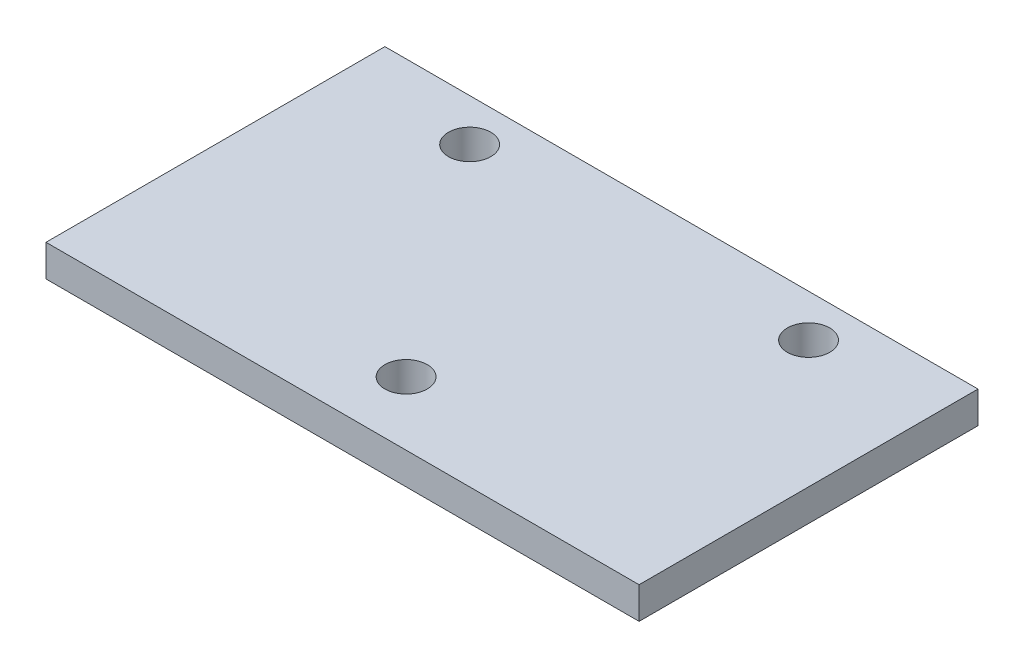
ISO-10303-21;
HEADER;
FILE_DESCRIPTION(('STEP AP214'),'2;1');
FILE_NAME('part.step','',(''),(''),'','','');
FILE_SCHEMA(('AUTOMOTIVE_DESIGN { 1 0 10303 214 1 1 1 1 }'));
ENDSEC;
DATA;
#1=APPLICATION_CONTEXT('core data for automotive mechanical design processes');
#2=APPLICATION_PROTOCOL_DEFINITION('international standard','automotive_design',2000,#1);
#3=PRODUCT_CONTEXT('',#1,'mechanical');
#4=PRODUCT('Part','Part','',(#3));
#5=PRODUCT_RELATED_PRODUCT_CATEGORY('part','',(#4));
#6=PRODUCT_DEFINITION_FORMATION('','',#4);
#7=PRODUCT_DEFINITION_CONTEXT('part definition',#1,'design');
#8=PRODUCT_DEFINITION('design','',#6,#7);
#9=PRODUCT_DEFINITION_SHAPE('','',#8);
#10=(LENGTH_UNIT() NAMED_UNIT(*) SI_UNIT(.MILLI.,.METRE.));
#11=(NAMED_UNIT(*) PLANE_ANGLE_UNIT() SI_UNIT($,.RADIAN.));
#12=(NAMED_UNIT(*) SI_UNIT($,.STERADIAN.) SOLID_ANGLE_UNIT());
#13=UNCERTAINTY_MEASURE_WITH_UNIT(LENGTH_MEASURE(1.E-05),#10,'distance_accuracy_value','');
#14=(GEOMETRIC_REPRESENTATION_CONTEXT(3) GLOBAL_UNCERTAINTY_ASSIGNED_CONTEXT((#13)) GLOBAL_UNIT_ASSIGNED_CONTEXT((#10,
#11,#12)) REPRESENTATION_CONTEXT('',''));
#15=CARTESIAN_POINT('',(0.,0.,0.));
#16=DIRECTION('',(0.,0.,1.));
#17=DIRECTION('',(1.,0.,0.));
#18=AXIS2_PLACEMENT_3D('',#15,#16,#17);
#19=CARTESIAN_POINT('',(-88.9,9.525,50.8));
#20=DIRECTION('',(-1.,0.,0.));
#21=DIRECTION('',(0.,0.,1.));
#22=AXIS2_PLACEMENT_3D('',#19,#20,#21);
#23=PLANE('',#22);
#24=DIRECTION('',(0.,0.,-1.));
#25=VECTOR('',#24,1.);
#26=CARTESIAN_POINT('',(-88.9,0.,50.8));
#27=LINE('',#26,#25);
#28=CARTESIAN_POINT('',(-88.9,0.,50.8));
#29=VERTEX_POINT('',#28);
#30=CARTESIAN_POINT('',(-88.9,0.,-50.8));
#31=VERTEX_POINT('',#30);
#32=EDGE_CURVE('E98',#29,#31,#27,.T.);
#33=ORIENTED_EDGE('',*,*,#32,.F.);
#34=DIRECTION('',(0.,-1.,0.));
#35=VECTOR('',#34,1.);
#36=CARTESIAN_POINT('',(-88.9,9.525,50.8));
#37=LINE('',#36,#35);
#38=CARTESIAN_POINT('',(-88.9,9.525,50.8));
#39=VERTEX_POINT('',#38);
#40=EDGE_CURVE('E11',#39,#29,#37,.T.);
#41=ORIENTED_EDGE('',*,*,#40,.F.);
#42=DIRECTION('',(0.,0.,-1.));
#43=VECTOR('',#42,1.);
#44=CARTESIAN_POINT('',(-88.9,9.525,50.8));
#45=LINE('',#44,#43);
#46=CARTESIAN_POINT('',(-88.9,9.525,-50.8));
#47=VERTEX_POINT('',#46);
#48=EDGE_CURVE('E90',#39,#47,#45,.T.);
#49=ORIENTED_EDGE('',*,*,#48,.T.);
#50=DIRECTION('',(0.,-1.,0.));
#51=VECTOR('',#50,1.);
#52=CARTESIAN_POINT('',(-88.9,9.525,-50.8));
#53=LINE('',#52,#51);
#54=EDGE_CURVE('E37',#47,#31,#53,.T.);
#55=ORIENTED_EDGE('',*,*,#54,.T.);
#56=EDGE_LOOP('',(#33,#41,#49,#55));
#57=FACE_BOUND('',#56,.T.);
#58=ADVANCED_FACE('F34',(#57),#23,.T.);
#59=CARTESIAN_POINT('',(-88.9,9.525,50.8));
#60=DIRECTION('',(0.,0.,-1.));
#61=DIRECTION('',(-1.,0.,0.));
#62=AXIS2_PLACEMENT_3D('',#59,#60,#61);
#63=PLANE('',#62);
#64=DIRECTION('',(1.,0.,0.));
#65=VECTOR('',#64,1.);
#66=CARTESIAN_POINT('',(-88.9,0.,50.8));
#67=LINE('',#66,#65);
#68=CARTESIAN_POINT('',(88.9,0.,50.8));
#69=VERTEX_POINT('',#68);
#70=EDGE_CURVE('E105',#29,#69,#67,.T.);
#71=ORIENTED_EDGE('',*,*,#70,.T.);
#72=DIRECTION('',(0.,-1.,0.));
#73=VECTOR('',#72,1.);
#74=CARTESIAN_POINT('',(88.9,9.525,50.8));
#75=LINE('',#74,#73);
#76=CARTESIAN_POINT('',(88.9,9.525,50.8));
#77=VERTEX_POINT('',#76);
#78=EDGE_CURVE('E43',#77,#69,#75,.T.);
#79=ORIENTED_EDGE('',*,*,#78,.F.);
#80=DIRECTION('',(1.,0.,0.));
#81=VECTOR('',#80,1.);
#82=CARTESIAN_POINT('',(-88.9,9.525,50.8));
#83=LINE('',#82,#81);
#84=EDGE_CURVE('E93',#39,#77,#83,.T.);
#85=ORIENTED_EDGE('',*,*,#84,.F.);
#86=ORIENTED_EDGE('',*,*,#40,.T.);
#87=EDGE_LOOP('',(#71,#79,#85,#86));
#88=FACE_BOUND('',#87,.T.);
#89=ADVANCED_FACE('F156',(#88),#63,.F.);
#90=CARTESIAN_POINT('',(88.9,9.525,-50.8));
#91=DIRECTION('',(1.,0.,0.));
#92=DIRECTION('',(0.,0.,-1.));
#93=AXIS2_PLACEMENT_3D('',#90,#91,#92);
#94=PLANE('',#93);
#95=DIRECTION('',(0.,0.,1.));
#96=VECTOR('',#95,1.);
#97=CARTESIAN_POINT('',(88.9,0.,-50.8));
#98=LINE('',#97,#96);
#99=CARTESIAN_POINT('',(88.9,0.,-50.8));
#100=VERTEX_POINT('',#99);
#101=EDGE_CURVE('E85',#100,#69,#98,.T.);
#102=ORIENTED_EDGE('',*,*,#101,.F.);
#103=DIRECTION('',(0.,-1.,0.));
#104=VECTOR('',#103,1.);
#105=CARTESIAN_POINT('',(88.9,9.525,-50.8));
#106=LINE('',#105,#104);
#107=CARTESIAN_POINT('',(88.9,9.525,-50.8));
#108=VERTEX_POINT('',#107);
#109=EDGE_CURVE('E81',#108,#100,#106,.T.);
#110=ORIENTED_EDGE('',*,*,#109,.F.);
#111=DIRECTION('',(0.,0.,1.));
#112=VECTOR('',#111,1.);
#113=CARTESIAN_POINT('',(88.9,9.525,-50.8));
#114=LINE('',#113,#112);
#115=EDGE_CURVE('E83',#108,#77,#114,.T.);
#116=ORIENTED_EDGE('',*,*,#115,.T.);
#117=ORIENTED_EDGE('',*,*,#78,.T.);
#118=EDGE_LOOP('',(#102,#110,#116,#117));
#119=FACE_BOUND('',#118,.T.);
#120=ADVANCED_FACE('F82',(#119),#94,.T.);
#121=CARTESIAN_POINT('',(88.9,9.525,-50.8));
#122=DIRECTION('',(0.,0.,1.));
#123=DIRECTION('',(1.,0.,0.));
#124=AXIS2_PLACEMENT_3D('',#121,#122,#123);
#125=PLANE('',#124);
#126=DIRECTION('',(-1.,0.,0.));
#127=VECTOR('',#126,1.);
#128=CARTESIAN_POINT('',(88.9,0.,-50.8));
#129=LINE('',#128,#127);
#130=EDGE_CURVE('E101',#100,#31,#129,.T.);
#131=ORIENTED_EDGE('',*,*,#130,.T.);
#132=ORIENTED_EDGE('',*,*,#54,.F.);
#133=DIRECTION('',(-1.,0.,0.));
#134=VECTOR('',#133,1.);
#135=CARTESIAN_POINT('',(88.9,9.525,-50.8));
#136=LINE('',#135,#134);
#137=EDGE_CURVE('E78',#108,#47,#136,.T.);
#138=ORIENTED_EDGE('',*,*,#137,.F.);
#139=ORIENTED_EDGE('',*,*,#109,.T.);
#140=EDGE_LOOP('',(#131,#132,#138,#139));
#141=FACE_BOUND('',#140,.T.);
#142=ADVANCED_FACE('F89',(#141),#125,.F.);
#143=CARTESIAN_POINT('',(-88.9,9.525,50.8));
#144=DIRECTION('',(0.,-1.,0.));
#145=DIRECTION('',(0.,0.,-1.));
#146=AXIS2_PLACEMENT_3D('',#143,#144,#145);
#147=PLANE('',#146);
#148=CARTESIAN_POINT('',(0.,9.525,31.75));
#149=DIRECTION('',(0.,1.,0.));
#150=DIRECTION('',(0.,0.,1.));
#151=AXIS2_PLACEMENT_3D('',#148,#149,#150);
#152=CIRCLE('',#151,6.35);
#153=CARTESIAN_POINT('',(0.,9.525,38.1));
#154=VERTEX_POINT('',#153);
#155=EDGE_CURVE('E120',#154,#154,#152,.T.);
#156=ORIENTED_EDGE('',*,*,#155,.F.);
#157=EDGE_LOOP('',(#156));
#158=FACE_BOUND('',#157,.T.);
#159=CARTESIAN_POINT('',(50.8,9.525,-38.1));
#160=DIRECTION('',(0.,1.,0.));
#161=DIRECTION('',(0.,0.,1.));
#162=AXIS2_PLACEMENT_3D('',#159,#160,#161);
#163=CIRCLE('',#162,6.35);
#164=CARTESIAN_POINT('',(50.8,9.525,-31.75));
#165=VERTEX_POINT('',#164);
#166=EDGE_CURVE('E114',#165,#165,#163,.T.);
#167=ORIENTED_EDGE('',*,*,#166,.F.);
#168=EDGE_LOOP('',(#167));
#169=FACE_BOUND('',#168,.T.);
#170=CARTESIAN_POINT('',(-50.8,9.525,-38.1));
#171=DIRECTION('',(0.,1.,0.));
#172=DIRECTION('',(0.,0.,1.));
#173=AXIS2_PLACEMENT_3D('',#170,#171,#172);
#174=CIRCLE('',#173,6.35);
#175=CARTESIAN_POINT('',(-50.8,9.525,-31.75));
#176=VERTEX_POINT('',#175);
#177=EDGE_CURVE('E108',#176,#176,#174,.T.);
#178=ORIENTED_EDGE('',*,*,#177,.F.);
#179=EDGE_LOOP('',(#178));
#180=FACE_BOUND('',#179,.T.);
#181=ORIENTED_EDGE('',*,*,#48,.F.);
#182=ORIENTED_EDGE('',*,*,#84,.T.);
#183=ORIENTED_EDGE('',*,*,#115,.F.);
#184=ORIENTED_EDGE('',*,*,#137,.T.);
#185=EDGE_LOOP('',(#181,#182,#183,#184));
#186=FACE_BOUND('',#185,.T.);
#187=ADVANCED_FACE('F92',(#158,#169,#180,#186),#147,.F.);
#188=CARTESIAN_POINT('',(-88.9,0.,50.8));
#189=DIRECTION('',(0.,-1.,0.));
#190=DIRECTION('',(0.,0.,-1.));
#191=AXIS2_PLACEMENT_3D('',#188,#189,#190);
#192=PLANE('',#191);
#193=CARTESIAN_POINT('',(0.,0.,31.75));
#194=DIRECTION('',(0.,1.,0.));
#195=DIRECTION('',(0.,0.,1.));
#196=AXIS2_PLACEMENT_3D('',#193,#194,#195);
#197=CIRCLE('',#196,6.35);
#198=CARTESIAN_POINT('',(0.,0.,38.1));
#199=VERTEX_POINT('',#198);
#200=EDGE_CURVE('E117',#199,#199,#197,.T.);
#201=ORIENTED_EDGE('',*,*,#200,.T.);
#202=EDGE_LOOP('',(#201));
#203=FACE_BOUND('',#202,.T.);
#204=CARTESIAN_POINT('',(50.8,0.,-38.1));
#205=DIRECTION('',(0.,1.,0.));
#206=DIRECTION('',(0.,0.,1.));
#207=AXIS2_PLACEMENT_3D('',#204,#205,#206);
#208=CIRCLE('',#207,6.35);
#209=CARTESIAN_POINT('',(50.8,0.,-31.75));
#210=VERTEX_POINT('',#209);
#211=EDGE_CURVE('E111',#210,#210,#208,.T.);
#212=ORIENTED_EDGE('',*,*,#211,.T.);
#213=EDGE_LOOP('',(#212));
#214=FACE_BOUND('',#213,.T.);
#215=CARTESIAN_POINT('',(-50.8,0.,-38.1));
#216=DIRECTION('',(0.,1.,0.));
#217=DIRECTION('',(0.,0.,1.));
#218=AXIS2_PLACEMENT_3D('',#215,#216,#217);
#219=CIRCLE('',#218,6.35);
#220=CARTESIAN_POINT('',(-50.8,0.,-31.75));
#221=VERTEX_POINT('',#220);
#222=EDGE_CURVE('E102',#221,#221,#219,.T.);
#223=ORIENTED_EDGE('',*,*,#222,.T.);
#224=EDGE_LOOP('',(#223));
#225=FACE_BOUND('',#224,.T.);
#226=ORIENTED_EDGE('',*,*,#32,.T.);
#227=ORIENTED_EDGE('',*,*,#130,.F.);
#228=ORIENTED_EDGE('',*,*,#101,.T.);
#229=ORIENTED_EDGE('',*,*,#70,.F.);
#230=EDGE_LOOP('',(#226,#227,#228,#229));
#231=FACE_BOUND('',#230,.T.);
#232=ADVANCED_FACE('F126',(#203,#214,#225,#231),#192,.T.);
#233=CARTESIAN_POINT('',(-50.8,0.,-38.1));
#234=DIRECTION('',(0.,1.,0.));
#235=DIRECTION('',(0.,0.,1.));
#236=AXIS2_PLACEMENT_3D('',#233,#234,#235);
#237=CYLINDRICAL_SURFACE('',#236,6.35);
#238=CARTESIAN_POINT('',(-50.8,0.,-31.75));
#239=CARTESIAN_POINT('',(-50.8,0.0992187499999999,-31.75));
#240=CARTESIAN_POINT('',(-50.8,0.1984375,-31.75));
#241=CARTESIAN_POINT('',(-50.8,0.396875,-31.75));
#242=CARTESIAN_POINT('',(-50.8,0.49609375,-31.75));
#243=CARTESIAN_POINT('',(-50.8,0.69453125,-31.75));
#244=CARTESIAN_POINT('',(-50.8,0.79375,-31.75));
#245=CARTESIAN_POINT('',(-50.8,0.9921875,-31.75));
#246=CARTESIAN_POINT('',(-50.8,1.09140625,-31.75));
#247=CARTESIAN_POINT('',(-50.8,1.28984375,-31.75));
#248=CARTESIAN_POINT('',(-50.8,1.3890625,-31.75));
#249=CARTESIAN_POINT('',(-50.8,1.5875,-31.75));
#250=CARTESIAN_POINT('',(-50.8,1.68671875,-31.75));
#251=CARTESIAN_POINT('',(-50.8,1.88515625,-31.75));
#252=CARTESIAN_POINT('',(-50.8,1.984375,-31.75));
#253=CARTESIAN_POINT('',(-50.8,2.1828125,-31.75));
#254=CARTESIAN_POINT('',(-50.8,2.28203125,-31.75));
#255=CARTESIAN_POINT('',(-50.8,2.48046875,-31.75));
#256=CARTESIAN_POINT('',(-50.8,2.5796875,-31.75));
#257=CARTESIAN_POINT('',(-50.8,2.778125,-31.75));
#258=CARTESIAN_POINT('',(-50.8,2.87734375,-31.75));
#259=CARTESIAN_POINT('',(-50.8,3.07578125,-31.75));
#260=CARTESIAN_POINT('',(-50.8,3.175,-31.75));
#261=CARTESIAN_POINT('',(-50.8,3.3734375,-31.75));
#262=CARTESIAN_POINT('',(-50.8,3.47265625,-31.75));
#263=CARTESIAN_POINT('',(-50.8,3.67109375,-31.75));
#264=CARTESIAN_POINT('',(-50.8,3.7703125,-31.75));
#265=CARTESIAN_POINT('',(-50.8,3.96875,-31.75));
#266=CARTESIAN_POINT('',(-50.8,4.06796875,-31.75));
#267=CARTESIAN_POINT('',(-50.8,4.26640625,-31.75));
#268=CARTESIAN_POINT('',(-50.8,4.365625,-31.75));
#269=CARTESIAN_POINT('',(-50.8,4.5640625,-31.75));
#270=CARTESIAN_POINT('',(-50.8,4.66328125,-31.75));
#271=CARTESIAN_POINT('',(-50.8,4.86171875,-31.75));
#272=CARTESIAN_POINT('',(-50.8,4.9609375,-31.75));
#273=CARTESIAN_POINT('',(-50.8,5.159375,-31.75));
#274=CARTESIAN_POINT('',(-50.8,5.25859375,-31.75));
#275=CARTESIAN_POINT('',(-50.8,5.45703125,-31.75));
#276=CARTESIAN_POINT('',(-50.8,5.55625,-31.75));
#277=CARTESIAN_POINT('',(-50.8,5.7546875,-31.75));
#278=CARTESIAN_POINT('',(-50.8,5.85390625,-31.75));
#279=CARTESIAN_POINT('',(-50.8,6.05234375,-31.75));
#280=CARTESIAN_POINT('',(-50.8,6.1515625,-31.75));
#281=CARTESIAN_POINT('',(-50.8,6.35,-31.75));
#282=CARTESIAN_POINT('',(-50.8,6.44921875,-31.75));
#283=CARTESIAN_POINT('',(-50.8,6.64765625,-31.75));
#284=CARTESIAN_POINT('',(-50.8,6.746875,-31.75));
#285=CARTESIAN_POINT('',(-50.8,6.9453125,-31.75));
#286=CARTESIAN_POINT('',(-50.8,7.04453125,-31.75));
#287=CARTESIAN_POINT('',(-50.8,7.24296875,-31.75));
#288=CARTESIAN_POINT('',(-50.8,7.3421875,-31.75));
#289=CARTESIAN_POINT('',(-50.8,7.540625,-31.75));
#290=CARTESIAN_POINT('',(-50.8,7.63984375,-31.75));
#291=CARTESIAN_POINT('',(-50.8,7.83828125,-31.75));
#292=CARTESIAN_POINT('',(-50.8,7.9375,-31.75));
#293=CARTESIAN_POINT('',(-50.8,8.1359375,-31.75));
#294=CARTESIAN_POINT('',(-50.8,8.23515625,-31.75));
#295=CARTESIAN_POINT('',(-50.8,8.43359375,-31.75));
#296=CARTESIAN_POINT('',(-50.8,8.5328125,-31.75));
#297=CARTESIAN_POINT('',(-50.8,8.73125,-31.75));
#298=CARTESIAN_POINT('',(-50.8,8.83046875,-31.75));
#299=CARTESIAN_POINT('',(-50.8,9.02890625,-31.75));
#300=CARTESIAN_POINT('',(-50.8,9.128125,-31.75));
#301=CARTESIAN_POINT('',(-50.8,9.3265625,-31.75));
#302=CARTESIAN_POINT('',(-50.8,9.42578125,-31.75));
#303=CARTESIAN_POINT('',(-50.8,9.525,-31.75));
#304=B_SPLINE_CURVE_WITH_KNOTS('',3,(#238,#239,#240,#241,#242,#243,#244,#245,#246,#247,#248,
#249,#250,#251,#252,#253,#254,#255,#256,#257,#258,#259,#260,#261,#262,#263,#264,#265,#266,#267,
#268,#269,#270,#271,#272,#273,#274,#275,#276,#277,#278,#279,#280,#281,#282,#283,#284,#285,#286,
#287,#288,#289,#290,#291,#292,#293,#294,#295,#296,#297,#298,#299,#300,#301,#302,#303),
.UNSPECIFIED.,.F.,.F.,(4,2,2,2,2,2,2,2,2,2,2,2,2,2,2,2,2,2,2,2,2,2,2,2,2,2,2,2,2,2,2,2,4),(0.,
0.29765625,0.5953125,0.89296875,1.190625,1.48828125,1.7859375,2.08359375,2.38125,2.67890625,
2.9765625,3.27421875,3.571875,3.86953125,4.1671875,4.46484375,4.7625,5.06015625,5.3578125,
5.65546875,5.953125,6.25078125,6.5484375,6.84609375,7.14375,7.44140625,7.7390625,8.03671875,
8.334375,8.63203125,8.9296875,9.22734375,9.525),.UNSPECIFIED.);
#305=EDGE_CURVE('BSEAM143',#221,#176,#304,.T.);
#306=ORIENTED_EDGE('',*,*,#222,.F.);
#307=ORIENTED_EDGE('',*,*,#177,.T.);
#308=ORIENTED_EDGE('',*,*,#305,.T.);
#309=ORIENTED_EDGE('',*,*,#305,.F.);
#310=EDGE_LOOP('',(#306,#308,#307,#309));
#311=FACE_BOUND('',#310,.T.);
#312=ADVANCED_FACE('F143',(#311),#237,.F.);
#313=CARTESIAN_POINT('',(50.8,0.,-38.1));
#314=DIRECTION('',(0.,1.,0.));
#315=DIRECTION('',(0.,0.,1.));
#316=AXIS2_PLACEMENT_3D('',#313,#314,#315);
#317=CYLINDRICAL_SURFACE('',#316,6.35);
#318=CARTESIAN_POINT('',(50.8,0.,-31.75));
#319=CARTESIAN_POINT('',(50.8,0.0992187499999999,-31.75));
#320=CARTESIAN_POINT('',(50.8,0.1984375,-31.75));
#321=CARTESIAN_POINT('',(50.8,0.396875,-31.75));
#322=CARTESIAN_POINT('',(50.8,0.49609375,-31.75));
#323=CARTESIAN_POINT('',(50.8,0.69453125,-31.75));
#324=CARTESIAN_POINT('',(50.8,0.79375,-31.75));
#325=CARTESIAN_POINT('',(50.8,0.9921875,-31.75));
#326=CARTESIAN_POINT('',(50.8,1.09140625,-31.75));
#327=CARTESIAN_POINT('',(50.8,1.28984375,-31.75));
#328=CARTESIAN_POINT('',(50.8,1.3890625,-31.75));
#329=CARTESIAN_POINT('',(50.8,1.5875,-31.75));
#330=CARTESIAN_POINT('',(50.8,1.68671875,-31.75));
#331=CARTESIAN_POINT('',(50.8,1.88515625,-31.75));
#332=CARTESIAN_POINT('',(50.8,1.984375,-31.75));
#333=CARTESIAN_POINT('',(50.8,2.1828125,-31.75));
#334=CARTESIAN_POINT('',(50.8,2.28203125,-31.75));
#335=CARTESIAN_POINT('',(50.8,2.48046875,-31.75));
#336=CARTESIAN_POINT('',(50.8,2.5796875,-31.75));
#337=CARTESIAN_POINT('',(50.8,2.778125,-31.75));
#338=CARTESIAN_POINT('',(50.8,2.87734375,-31.75));
#339=CARTESIAN_POINT('',(50.8,3.07578125,-31.75));
#340=CARTESIAN_POINT('',(50.8,3.175,-31.75));
#341=CARTESIAN_POINT('',(50.8,3.3734375,-31.75));
#342=CARTESIAN_POINT('',(50.8,3.47265625,-31.75));
#343=CARTESIAN_POINT('',(50.8,3.67109375,-31.75));
#344=CARTESIAN_POINT('',(50.8,3.7703125,-31.75));
#345=CARTESIAN_POINT('',(50.8,3.96875,-31.75));
#346=CARTESIAN_POINT('',(50.8,4.06796875,-31.75));
#347=CARTESIAN_POINT('',(50.8,4.26640625,-31.75));
#348=CARTESIAN_POINT('',(50.8,4.365625,-31.75));
#349=CARTESIAN_POINT('',(50.8,4.5640625,-31.75));
#350=CARTESIAN_POINT('',(50.8,4.66328125,-31.75));
#351=CARTESIAN_POINT('',(50.8,4.86171875,-31.75));
#352=CARTESIAN_POINT('',(50.8,4.9609375,-31.75));
#353=CARTESIAN_POINT('',(50.8,5.159375,-31.75));
#354=CARTESIAN_POINT('',(50.8,5.25859375,-31.75));
#355=CARTESIAN_POINT('',(50.8,5.45703125,-31.75));
#356=CARTESIAN_POINT('',(50.8,5.55625,-31.75));
#357=CARTESIAN_POINT('',(50.8,5.7546875,-31.75));
#358=CARTESIAN_POINT('',(50.8,5.85390625,-31.75));
#359=CARTESIAN_POINT('',(50.8,6.05234375,-31.75));
#360=CARTESIAN_POINT('',(50.8,6.1515625,-31.75));
#361=CARTESIAN_POINT('',(50.8,6.35,-31.75));
#362=CARTESIAN_POINT('',(50.8,6.44921875,-31.75));
#363=CARTESIAN_POINT('',(50.8,6.64765625,-31.75));
#364=CARTESIAN_POINT('',(50.8,6.746875,-31.75));
#365=CARTESIAN_POINT('',(50.8,6.9453125,-31.75));
#366=CARTESIAN_POINT('',(50.8,7.04453125,-31.75));
#367=CARTESIAN_POINT('',(50.8,7.24296875,-31.75));
#368=CARTESIAN_POINT('',(50.8,7.3421875,-31.75));
#369=CARTESIAN_POINT('',(50.8,7.540625,-31.75));
#370=CARTESIAN_POINT('',(50.8,7.63984375,-31.75));
#371=CARTESIAN_POINT('',(50.8,7.83828125,-31.75));
#372=CARTESIAN_POINT('',(50.8,7.9375,-31.75));
#373=CARTESIAN_POINT('',(50.8,8.1359375,-31.75));
#374=CARTESIAN_POINT('',(50.8,8.23515625,-31.75));
#375=CARTESIAN_POINT('',(50.8,8.43359375,-31.75));
#376=CARTESIAN_POINT('',(50.8,8.5328125,-31.75));
#377=CARTESIAN_POINT('',(50.8,8.73125,-31.75));
#378=CARTESIAN_POINT('',(50.8,8.83046875,-31.75));
#379=CARTESIAN_POINT('',(50.8,9.02890625,-31.75));
#380=CARTESIAN_POINT('',(50.8,9.128125,-31.75));
#381=CARTESIAN_POINT('',(50.8,9.3265625,-31.75));
#382=CARTESIAN_POINT('',(50.8,9.42578125,-31.75));
#383=CARTESIAN_POINT('',(50.8,9.525,-31.75));
#384=B_SPLINE_CURVE_WITH_KNOTS('',3,(#318,#319,#320,#321,#322,#323,#324,#325,#326,#327,#328,
#329,#330,#331,#332,#333,#334,#335,#336,#337,#338,#339,#340,#341,#342,#343,#344,#345,#346,#347,
#348,#349,#350,#351,#352,#353,#354,#355,#356,#357,#358,#359,#360,#361,#362,#363,#364,#365,#366,
#367,#368,#369,#370,#371,#372,#373,#374,#375,#376,#377,#378,#379,#380,#381,#382,#383),
.UNSPECIFIED.,.F.,.F.,(4,2,2,2,2,2,2,2,2,2,2,2,2,2,2,2,2,2,2,2,2,2,2,2,2,2,2,2,2,2,2,2,4),(0.,
0.29765625,0.5953125,0.89296875,1.190625,1.48828125,1.7859375,2.08359375,2.38125,2.67890625,
2.9765625,3.27421875,3.571875,3.86953125,4.1671875,4.46484375,4.7625,5.06015625,5.3578125,
5.65546875,5.953125,6.25078125,6.5484375,6.84609375,7.14375,7.44140625,7.7390625,8.03671875,
8.334375,8.63203125,8.9296875,9.22734375,9.525),.UNSPECIFIED.);
#385=EDGE_CURVE('BSEAM132',#210,#165,#384,.T.);
#386=ORIENTED_EDGE('',*,*,#211,.F.);
#387=ORIENTED_EDGE('',*,*,#166,.T.);
#388=ORIENTED_EDGE('',*,*,#385,.T.);
#389=ORIENTED_EDGE('',*,*,#385,.F.);
#390=EDGE_LOOP('',(#386,#388,#387,#389));
#391=FACE_BOUND('',#390,.T.);
#392=ADVANCED_FACE('F132',(#391),#317,.F.);
#393=CARTESIAN_POINT('',(0.,0.,31.75));
#394=DIRECTION('',(0.,1.,0.));
#395=DIRECTION('',(0.,0.,1.));
#396=AXIS2_PLACEMENT_3D('',#393,#394,#395);
#397=CYLINDRICAL_SURFACE('',#396,6.35);
#398=CARTESIAN_POINT('',(0.,0.,38.1));
#399=CARTESIAN_POINT('',(0.,0.0992187499999999,38.1));
#400=CARTESIAN_POINT('',(0.,0.1984375,38.1));
#401=CARTESIAN_POINT('',(0.,0.396875,38.1));
#402=CARTESIAN_POINT('',(0.,0.49609375,38.1));
#403=CARTESIAN_POINT('',(0.,0.69453125,38.1));
#404=CARTESIAN_POINT('',(0.,0.79375,38.1));
#405=CARTESIAN_POINT('',(0.,0.9921875,38.1));
#406=CARTESIAN_POINT('',(0.,1.09140625,38.1));
#407=CARTESIAN_POINT('',(0.,1.28984375,38.1));
#408=CARTESIAN_POINT('',(0.,1.3890625,38.1));
#409=CARTESIAN_POINT('',(0.,1.5875,38.1));
#410=CARTESIAN_POINT('',(0.,1.68671875,38.1));
#411=CARTESIAN_POINT('',(0.,1.88515625,38.1));
#412=CARTESIAN_POINT('',(0.,1.984375,38.1));
#413=CARTESIAN_POINT('',(0.,2.1828125,38.1));
#414=CARTESIAN_POINT('',(0.,2.28203125,38.1));
#415=CARTESIAN_POINT('',(0.,2.48046875,38.1));
#416=CARTESIAN_POINT('',(0.,2.5796875,38.1));
#417=CARTESIAN_POINT('',(0.,2.778125,38.1));
#418=CARTESIAN_POINT('',(0.,2.87734375,38.1));
#419=CARTESIAN_POINT('',(0.,3.07578125,38.1));
#420=CARTESIAN_POINT('',(0.,3.175,38.1));
#421=CARTESIAN_POINT('',(0.,3.3734375,38.1));
#422=CARTESIAN_POINT('',(0.,3.47265625,38.1));
#423=CARTESIAN_POINT('',(0.,3.67109375,38.1));
#424=CARTESIAN_POINT('',(0.,3.7703125,38.1));
#425=CARTESIAN_POINT('',(0.,3.96875,38.1));
#426=CARTESIAN_POINT('',(0.,4.06796875,38.1));
#427=CARTESIAN_POINT('',(0.,4.26640625,38.1));
#428=CARTESIAN_POINT('',(0.,4.365625,38.1));
#429=CARTESIAN_POINT('',(0.,4.5640625,38.1));
#430=CARTESIAN_POINT('',(0.,4.66328125,38.1));
#431=CARTESIAN_POINT('',(0.,4.86171875,38.1));
#432=CARTESIAN_POINT('',(0.,4.9609375,38.1));
#433=CARTESIAN_POINT('',(0.,5.159375,38.1));
#434=CARTESIAN_POINT('',(0.,5.25859375,38.1));
#435=CARTESIAN_POINT('',(0.,5.45703125,38.1));
#436=CARTESIAN_POINT('',(0.,5.55625,38.1));
#437=CARTESIAN_POINT('',(0.,5.7546875,38.1));
#438=CARTESIAN_POINT('',(0.,5.85390625,38.1));
#439=CARTESIAN_POINT('',(0.,6.05234375,38.1));
#440=CARTESIAN_POINT('',(0.,6.1515625,38.1));
#441=CARTESIAN_POINT('',(0.,6.35,38.1));
#442=CARTESIAN_POINT('',(0.,6.44921875,38.1));
#443=CARTESIAN_POINT('',(0.,6.64765625,38.1));
#444=CARTESIAN_POINT('',(0.,6.746875,38.1));
#445=CARTESIAN_POINT('',(0.,6.9453125,38.1));
#446=CARTESIAN_POINT('',(0.,7.04453125,38.1));
#447=CARTESIAN_POINT('',(0.,7.24296875,38.1));
#448=CARTESIAN_POINT('',(0.,7.3421875,38.1));
#449=CARTESIAN_POINT('',(0.,7.540625,38.1));
#450=CARTESIAN_POINT('',(0.,7.63984375,38.1));
#451=CARTESIAN_POINT('',(0.,7.83828125,38.1));
#452=CARTESIAN_POINT('',(0.,7.9375,38.1));
#453=CARTESIAN_POINT('',(0.,8.1359375,38.1));
#454=CARTESIAN_POINT('',(0.,8.23515625,38.1));
#455=CARTESIAN_POINT('',(0.,8.43359375,38.1));
#456=CARTESIAN_POINT('',(0.,8.5328125,38.1));
#457=CARTESIAN_POINT('',(0.,8.73125,38.1));
#458=CARTESIAN_POINT('',(0.,8.83046875,38.1));
#459=CARTESIAN_POINT('',(0.,9.02890625,38.1));
#460=CARTESIAN_POINT('',(0.,9.128125,38.1));
#461=CARTESIAN_POINT('',(0.,9.3265625,38.1));
#462=CARTESIAN_POINT('',(0.,9.42578125,38.1));
#463=CARTESIAN_POINT('',(0.,9.525,38.1));
#464=B_SPLINE_CURVE_WITH_KNOTS('',3,(#398,#399,#400,#401,#402,#403,#404,#405,#406,#407,#408,
#409,#410,#411,#412,#413,#414,#415,#416,#417,#418,#419,#420,#421,#422,#423,#424,#425,#426,#427,
#428,#429,#430,#431,#432,#433,#434,#435,#436,#437,#438,#439,#440,#441,#442,#443,#444,#445,#446,
#447,#448,#449,#450,#451,#452,#453,#454,#455,#456,#457,#458,#459,#460,#461,#462,#463),
.UNSPECIFIED.,.F.,.F.,(4,2,2,2,2,2,2,2,2,2,2,2,2,2,2,2,2,2,2,2,2,2,2,2,2,2,2,2,2,2,2,2,4),(0.,
0.29765625,0.5953125,0.89296875,1.190625,1.48828125,1.7859375,2.08359375,2.38125,2.67890625,
2.9765625,3.27421875,3.571875,3.86953125,4.1671875,4.46484375,4.7625,5.06015625,5.3578125,
5.65546875,5.953125,6.25078125,6.5484375,6.84609375,7.14375,7.44140625,7.7390625,8.03671875,
8.334375,8.63203125,8.9296875,9.22734375,9.525),.UNSPECIFIED.);
#465=EDGE_CURVE('BSEAM129',#199,#154,#464,.T.);
#466=ORIENTED_EDGE('',*,*,#200,.F.);
#467=ORIENTED_EDGE('',*,*,#155,.T.);
#468=ORIENTED_EDGE('',*,*,#465,.T.);
#469=ORIENTED_EDGE('',*,*,#465,.F.);
#470=EDGE_LOOP('',(#466,#468,#467,#469));
#471=FACE_BOUND('',#470,.T.);
#472=ADVANCED_FACE('F129',(#471),#397,.F.);
#473=CLOSED_SHELL('',(#58,#89,#120,#142,#187,#232,#312,#392,#472));
#474=MANIFOLD_SOLID_BREP('B2',#473);
#475=ADVANCED_BREP_SHAPE_REPRESENTATION('',(#18,#474),#14);
#476=SHAPE_DEFINITION_REPRESENTATION(#9,#475);
ENDSEC;
END-ISO-10303-21;
